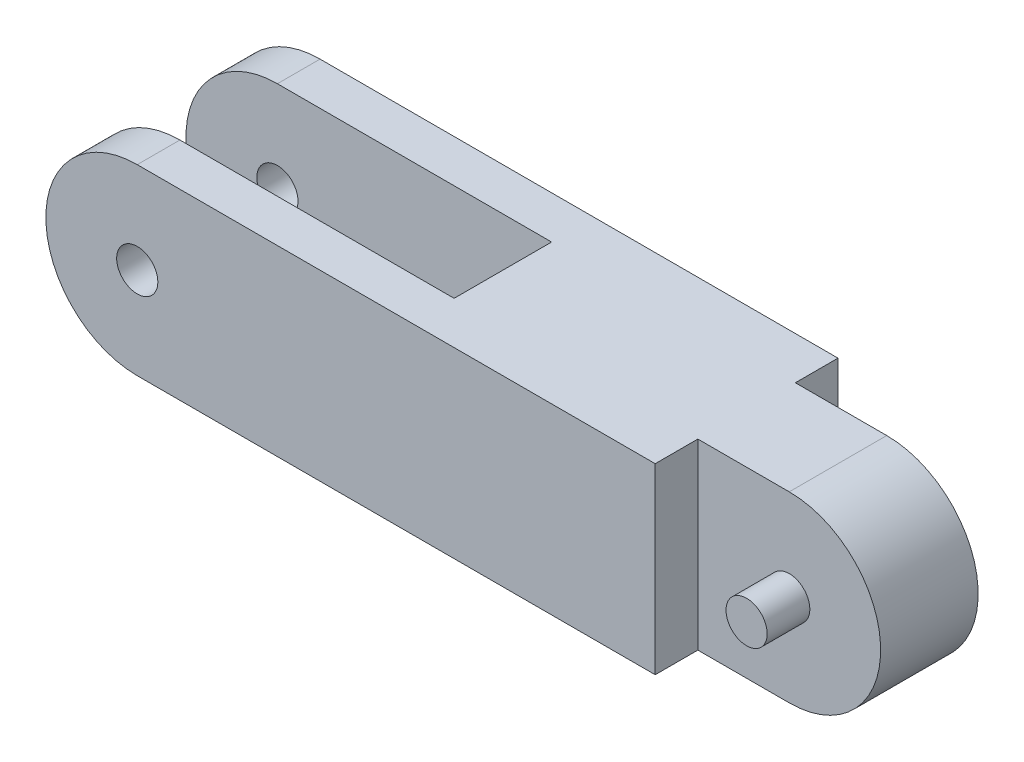
ISO-10303-21;
HEADER;
FILE_DESCRIPTION(('STEP AP214'),'2;1');
FILE_NAME('part.step','',(''),(''),'','','');
FILE_SCHEMA(('AUTOMOTIVE_DESIGN { 1 0 10303 214 1 1 1 1 }'));
ENDSEC;
DATA;
#1=APPLICATION_CONTEXT('core data for automotive mechanical design processes');
#2=APPLICATION_PROTOCOL_DEFINITION('international standard','automotive_design',2000,#1);
#3=PRODUCT_CONTEXT('',#1,'mechanical');
#4=PRODUCT('Part','Part','',(#3));
#5=PRODUCT_RELATED_PRODUCT_CATEGORY('part','',(#4));
#6=PRODUCT_DEFINITION_FORMATION('','',#4);
#7=PRODUCT_DEFINITION_CONTEXT('part definition',#1,'design');
#8=PRODUCT_DEFINITION('design','',#6,#7);
#9=PRODUCT_DEFINITION_SHAPE('','',#8);
#10=(LENGTH_UNIT() NAMED_UNIT(*) SI_UNIT(.MILLI.,.METRE.));
#11=(NAMED_UNIT(*) PLANE_ANGLE_UNIT() SI_UNIT($,.RADIAN.));
#12=(NAMED_UNIT(*) SI_UNIT($,.STERADIAN.) SOLID_ANGLE_UNIT());
#13=UNCERTAINTY_MEASURE_WITH_UNIT(LENGTH_MEASURE(1.E-05),#10,'distance_accuracy_value','');
#14=(GEOMETRIC_REPRESENTATION_CONTEXT(3) GLOBAL_UNCERTAINTY_ASSIGNED_CONTEXT((#13)) GLOBAL_UNIT_ASSIGNED_CONTEXT((#10,
#11,#12)) REPRESENTATION_CONTEXT('',''));
#15=CARTESIAN_POINT('',(0.,0.,0.));
#16=DIRECTION('',(0.,0.,1.));
#17=DIRECTION('',(1.,0.,0.));
#18=AXIS2_PLACEMENT_3D('',#15,#16,#17);
#19=CARTESIAN_POINT('',(-50.,0.,15.));
#20=DIRECTION('',(0.,0.,-1.));
#21=DIRECTION('',(-1.,0.,0.));
#22=AXIS2_PLACEMENT_3D('',#19,#20,#21);
#23=CYLINDRICAL_SURFACE('',#22,15.);
#24=CARTESIAN_POINT('',(-50.,0.,-8.));
#25=DIRECTION('',(0.,0.,-1.));
#26=DIRECTION('',(-1.,0.,0.));
#27=AXIS2_PLACEMENT_3D('',#24,#25,#26);
#28=CIRCLE('',#27,15.);
#29=CARTESIAN_POINT('',(-50.,-15.,-8.));
#30=VERTEX_POINT('',#29);
#31=CARTESIAN_POINT('',(-50.,15.,-8.));
#32=VERTEX_POINT('',#31);
#33=EDGE_CURVE('E183',#30,#32,#28,.T.);
#34=ORIENTED_EDGE('',*,*,#33,.T.);
#35=DIRECTION('',(0.,0.,-1.));
#36=VECTOR('',#35,1.);
#37=CARTESIAN_POINT('',(-50.,15.,15.));
#38=LINE('',#37,#36);
#39=CARTESIAN_POINT('',(-50.,15.,-15.));
#40=VERTEX_POINT('',#39);
#41=EDGE_CURVE('E209',#32,#40,#38,.T.);
#42=ORIENTED_EDGE('',*,*,#41,.T.);
#43=CARTESIAN_POINT('',(-50.,0.,-15.));
#44=DIRECTION('',(0.,0.,1.));
#45=DIRECTION('',(1.,0.,0.));
#46=AXIS2_PLACEMENT_3D('',#43,#44,#45);
#47=CIRCLE('',#46,15.);
#48=CARTESIAN_POINT('',(-50.,-15.,-15.));
#49=VERTEX_POINT('',#48);
#50=EDGE_CURVE('E199',#40,#49,#47,.T.);
#51=ORIENTED_EDGE('',*,*,#50,.T.);
#52=DIRECTION('',(0.,0.,-1.));
#53=VECTOR('',#52,1.);
#54=CARTESIAN_POINT('',(-50.,-15.,15.));
#55=LINE('',#54,#53);
#56=EDGE_CURVE('E226',#30,#49,#55,.T.);
#57=ORIENTED_EDGE('',*,*,#56,.F.);
#58=EDGE_LOOP('',(#34,#42,#51,#57));
#59=FACE_BOUND('',#58,.T.);
#60=ADVANCED_FACE('F33',(#59),#23,.T.);
#61=CARTESIAN_POINT('',(-50.,0.,15.));
#62=DIRECTION('',(0.,0.,1.));
#63=DIRECTION('',(1.,0.,0.));
#64=AXIS2_PLACEMENT_3D('',#61,#62,#63);
#65=CYLINDRICAL_SURFACE('',#64,3.37819999999998);
#66=CARTESIAN_POINT('',(-50.,0.,-8.));
#67=DIRECTION('',(0.,0.,-1.));
#68=DIRECTION('',(-1.,0.,0.));
#69=AXIS2_PLACEMENT_3D('',#66,#67,#68);
#70=CIRCLE('',#69,3.37819999999998);
#71=CARTESIAN_POINT('',(-53.3782,0.,-8.));
#72=VERTEX_POINT('',#71);
#73=EDGE_CURVE('E182',#72,#72,#70,.F.);
#74=ORIENTED_EDGE('',*,*,#73,.T.);
#75=EDGE_LOOP('',(#74));
#76=FACE_BOUND('',#75,.T.);
#77=CARTESIAN_POINT('',(-50.,0.,-15.));
#78=DIRECTION('',(0.,0.,1.));
#79=DIRECTION('',(1.,0.,0.));
#80=AXIS2_PLACEMENT_3D('',#77,#78,#79);
#81=CIRCLE('',#80,3.37819999999998);
#82=CARTESIAN_POINT('',(-46.6218,0.,-15.));
#83=VERTEX_POINT('',#82);
#84=EDGE_CURVE('E196',#83,#83,#81,.T.);
#85=ORIENTED_EDGE('',*,*,#84,.F.);
#86=EDGE_LOOP('',(#85));
#87=FACE_BOUND('',#86,.T.);
#88=ADVANCED_FACE('F280',(#76,#87),#65,.F.);
#89=CARTESIAN_POINT('',(-50.,15.,15.));
#90=VERTEX_POINT('',#89);
#91=CARTESIAN_POINT('',(-50.,15.,8.));
#92=VERTEX_POINT('',#91);
#93=EDGE_CURVE('E217',#90,#92,#38,.T.);
#94=ORIENTED_EDGE('',*,*,#93,.T.);
#95=CARTESIAN_POINT('',(-50.,0.,8.));
#96=DIRECTION('',(0.,0.,1.));
#97=DIRECTION('',(1.,0.,0.));
#98=AXIS2_PLACEMENT_3D('',#95,#96,#97);
#99=CIRCLE('',#98,15.);
#100=CARTESIAN_POINT('',(-50.,-15.,8.));
#101=VERTEX_POINT('',#100);
#102=EDGE_CURVE('E48',#92,#101,#99,.T.);
#103=ORIENTED_EDGE('',*,*,#102,.T.);
#104=CARTESIAN_POINT('',(-50.,-15.,15.));
#105=VERTEX_POINT('',#104);
#106=EDGE_CURVE('E142',#105,#101,#55,.T.);
#107=ORIENTED_EDGE('',*,*,#106,.F.);
#108=CARTESIAN_POINT('',(-50.,0.,15.));
#109=DIRECTION('',(0.,0.,1.));
#110=DIRECTION('',(1.,0.,0.));
#111=AXIS2_PLACEMENT_3D('',#108,#109,#110);
#112=CIRCLE('',#111,15.);
#113=EDGE_CURVE('E200',#90,#105,#112,.T.);
#114=ORIENTED_EDGE('',*,*,#113,.F.);
#115=EDGE_LOOP('',(#94,#103,#107,#114));
#116=FACE_BOUND('',#115,.T.);
#117=ADVANCED_FACE('F35',(#116),#23,.T.);
#118=CARTESIAN_POINT('',(-50.,-15.,15.));
#119=DIRECTION('',(0.,1.,0.));
#120=DIRECTION('',(-1.,0.,0.));
#121=AXIS2_PLACEMENT_3D('',#118,#119,#120);
#122=PLANE('',#121);
#123=DIRECTION('',(0.,0.,-1.));
#124=VECTOR('',#123,1.);
#125=CARTESIAN_POINT('',(-5.00000000000002,-15.,-8.));
#126=LINE('',#125,#124);
#127=CARTESIAN_POINT('',(-5.00000000000002,-15.,8.));
#128=VERTEX_POINT('',#127);
#129=CARTESIAN_POINT('',(-5.00000000000002,-15.,-8.));
#130=VERTEX_POINT('',#129);
#131=EDGE_CURVE('E134',#128,#130,#126,.T.);
#132=ORIENTED_EDGE('',*,*,#131,.T.);
#133=DIRECTION('',(-1.,0.,0.));
#134=VECTOR('',#133,1.);
#135=CARTESIAN_POINT('',(-65.,-15.,-8.));
#136=LINE('',#135,#134);
#137=EDGE_CURVE('E131',#130,#30,#136,.T.);
#138=ORIENTED_EDGE('',*,*,#137,.T.);
#139=ORIENTED_EDGE('',*,*,#56,.T.);
#140=DIRECTION('',(1.,0.,0.));
#141=VECTOR('',#140,1.);
#142=CARTESIAN_POINT('',(-50.,-15.,-15.));
#143=LINE('',#142,#141);
#144=CARTESIAN_POINT('',(35.,-15.,-15.));
#145=VERTEX_POINT('',#144);
#146=EDGE_CURVE('E212',#49,#145,#143,.T.);
#147=ORIENTED_EDGE('',*,*,#146,.T.);
#148=DIRECTION('',(0.,0.,1.));
#149=VECTOR('',#148,1.);
#150=CARTESIAN_POINT('',(35.,-15.,-28.9161112376698));
#151=LINE('',#150,#149);
#152=CARTESIAN_POINT('',(35.,-15.,-8.));
#153=VERTEX_POINT('',#152);
#154=EDGE_CURVE('E158',#145,#153,#151,.T.);
#155=ORIENTED_EDGE('',*,*,#154,.T.);
#156=DIRECTION('',(1.,0.,0.));
#157=VECTOR('',#156,1.);
#158=CARTESIAN_POINT('',(35.,-15.,-8.));
#159=LINE('',#158,#157);
#160=CARTESIAN_POINT('',(50.,-15.,-8.));
#161=VERTEX_POINT('',#160);
#162=EDGE_CURVE('E161',#153,#161,#159,.T.);
#163=ORIENTED_EDGE('',*,*,#162,.T.);
#164=DIRECTION('',(0.,0.,-1.));
#165=VECTOR('',#164,1.);
#166=CARTESIAN_POINT('',(50.,-15.,15.));
#167=LINE('',#166,#165);
#168=CARTESIAN_POINT('',(50.,-15.,8.));
#169=VERTEX_POINT('',#168);
#170=EDGE_CURVE('E223',#169,#161,#167,.T.);
#171=ORIENTED_EDGE('',*,*,#170,.F.);
#172=DIRECTION('',(-1.,0.,0.));
#173=VECTOR('',#172,1.);
#174=CARTESIAN_POINT('',(35.,-15.,8.));
#175=LINE('',#174,#173);
#176=CARTESIAN_POINT('',(35.,-15.,8.));
#177=VERTEX_POINT('',#176);
#178=EDGE_CURVE('E174',#169,#177,#175,.T.);
#179=ORIENTED_EDGE('',*,*,#178,.T.);
#180=DIRECTION('',(0.,0.,1.));
#181=VECTOR('',#180,1.);
#182=CARTESIAN_POINT('',(35.,-15.,28.9161112376696));
#183=LINE('',#182,#181);
#184=CARTESIAN_POINT('',(35.,-15.,15.));
#185=VERTEX_POINT('',#184);
#186=EDGE_CURVE('E171',#177,#185,#183,.T.);
#187=ORIENTED_EDGE('',*,*,#186,.T.);
#188=DIRECTION('',(1.,0.,0.));
#189=VECTOR('',#188,1.);
#190=CARTESIAN_POINT('',(-50.,-15.,15.));
#191=LINE('',#190,#189);
#192=EDGE_CURVE('E203',#105,#185,#191,.T.);
#193=ORIENTED_EDGE('',*,*,#192,.F.);
#194=ORIENTED_EDGE('',*,*,#106,.T.);
#195=DIRECTION('',(1.,0.,0.));
#196=VECTOR('',#195,1.);
#197=CARTESIAN_POINT('',(-65.,-15.,8.));
#198=LINE('',#197,#196);
#199=EDGE_CURVE('E124',#101,#128,#198,.T.);
#200=ORIENTED_EDGE('',*,*,#199,.T.);
#201=EDGE_LOOP('',(#132,#138,#139,#147,#155,#163,#171,#179,#187,#193,#194,#200));
#202=FACE_BOUND('',#201,.T.);
#203=ADVANCED_FACE('F140',(#202),#122,.F.);
#204=CARTESIAN_POINT('',(50.,0.,15.));
#205=DIRECTION('',(0.,0.,-1.));
#206=DIRECTION('',(-1.,0.,0.));
#207=AXIS2_PLACEMENT_3D('',#204,#205,#206);
#208=CYLINDRICAL_SURFACE('',#207,15.);
#209=ORIENTED_EDGE('',*,*,#170,.T.);
#210=CARTESIAN_POINT('',(50.,0.,-8.));
#211=DIRECTION('',(0.,0.,1.));
#212=DIRECTION('',(1.,0.,0.));
#213=AXIS2_PLACEMENT_3D('',#210,#211,#212);
#214=CIRCLE('',#213,15.);
#215=CARTESIAN_POINT('',(50.,15.,-8.));
#216=VERTEX_POINT('',#215);
#217=EDGE_CURVE('E190',#161,#216,#214,.T.);
#218=ORIENTED_EDGE('',*,*,#217,.T.);
#219=DIRECTION('',(0.,0.,-1.));
#220=VECTOR('',#219,1.);
#221=CARTESIAN_POINT('',(50.,15.,15.));
#222=LINE('',#221,#220);
#223=CARTESIAN_POINT('',(50.,15.,8.));
#224=VERTEX_POINT('',#223);
#225=EDGE_CURVE('E220',#224,#216,#222,.T.);
#226=ORIENTED_EDGE('',*,*,#225,.F.);
#227=CARTESIAN_POINT('',(50.,0.,8.));
#228=DIRECTION('',(0.,0.,-1.));
#229=DIRECTION('',(-1.,0.,0.));
#230=AXIS2_PLACEMENT_3D('',#227,#228,#229);
#231=CIRCLE('',#230,15.);
#232=EDGE_CURVE('E186',#224,#169,#231,.T.);
#233=ORIENTED_EDGE('',*,*,#232,.T.);
#234=EDGE_LOOP('',(#209,#218,#226,#233));
#235=FACE_BOUND('',#234,.T.);
#236=ADVANCED_FACE('F256',(#235),#208,.T.);
#237=CARTESIAN_POINT('',(-50.,15.,15.));
#238=DIRECTION('',(0.,-1.,0.));
#239=DIRECTION('',(1.,0.,0.));
#240=AXIS2_PLACEMENT_3D('',#237,#238,#239);
#241=PLANE('',#240);
#242=ORIENTED_EDGE('',*,*,#41,.F.);
#243=DIRECTION('',(-1.,0.,0.));
#244=VECTOR('',#243,1.);
#245=CARTESIAN_POINT('',(-65.,15.,-8.));
#246=LINE('',#245,#244);
#247=CARTESIAN_POINT('',(-5.00000000000002,15.,-8.));
#248=VERTEX_POINT('',#247);
#249=EDGE_CURVE('E143',#248,#32,#246,.T.);
#250=ORIENTED_EDGE('',*,*,#249,.F.);
#251=DIRECTION('',(0.,0.,-1.));
#252=VECTOR('',#251,1.);
#253=CARTESIAN_POINT('',(-5.00000000000002,15.,-8.));
#254=LINE('',#253,#252);
#255=CARTESIAN_POINT('',(-5.00000000000002,15.,8.));
#256=VERTEX_POINT('',#255);
#257=EDGE_CURVE('E146',#256,#248,#254,.T.);
#258=ORIENTED_EDGE('',*,*,#257,.F.);
#259=DIRECTION('',(1.,0.,0.));
#260=VECTOR('',#259,1.);
#261=CARTESIAN_POINT('',(-65.,15.,8.));
#262=LINE('',#261,#260);
#263=EDGE_CURVE('E126',#92,#256,#262,.T.);
#264=ORIENTED_EDGE('',*,*,#263,.F.);
#265=ORIENTED_EDGE('',*,*,#93,.F.);
#266=DIRECTION('',(-1.,0.,0.));
#267=VECTOR('',#266,1.);
#268=CARTESIAN_POINT('',(-50.,15.,15.));
#269=LINE('',#268,#267);
#270=CARTESIAN_POINT('',(35.,15.,15.));
#271=VERTEX_POINT('',#270);
#272=EDGE_CURVE('E207',#271,#90,#269,.T.);
#273=ORIENTED_EDGE('',*,*,#272,.F.);
#274=DIRECTION('',(0.,0.,1.));
#275=VECTOR('',#274,1.);
#276=CARTESIAN_POINT('',(35.,15.,28.9161112376696));
#277=LINE('',#276,#275);
#278=CARTESIAN_POINT('',(35.,15.,8.));
#279=VERTEX_POINT('',#278);
#280=EDGE_CURVE('E55',#279,#271,#277,.T.);
#281=ORIENTED_EDGE('',*,*,#280,.F.);
#282=DIRECTION('',(-1.,0.,0.));
#283=VECTOR('',#282,1.);
#284=CARTESIAN_POINT('',(35.,15.,8.));
#285=LINE('',#284,#283);
#286=EDGE_CURVE('E175',#224,#279,#285,.T.);
#287=ORIENTED_EDGE('',*,*,#286,.F.);
#288=ORIENTED_EDGE('',*,*,#225,.T.);
#289=DIRECTION('',(1.,0.,0.));
#290=VECTOR('',#289,1.);
#291=CARTESIAN_POINT('',(35.,15.,-8.));
#292=LINE('',#291,#290);
#293=CARTESIAN_POINT('',(35.,15.,-8.));
#294=VERTEX_POINT('',#293);
#295=EDGE_CURVE('E162',#294,#216,#292,.T.);
#296=ORIENTED_EDGE('',*,*,#295,.F.);
#297=DIRECTION('',(0.,0.,1.));
#298=VECTOR('',#297,1.);
#299=CARTESIAN_POINT('',(35.,15.,-28.9161112376698));
#300=LINE('',#299,#298);
#301=CARTESIAN_POINT('',(35.,15.,-15.));
#302=VERTEX_POINT('',#301);
#303=EDGE_CURVE('E165',#302,#294,#300,.T.);
#304=ORIENTED_EDGE('',*,*,#303,.F.);
#305=DIRECTION('',(-1.,0.,0.));
#306=VECTOR('',#305,1.);
#307=CARTESIAN_POINT('',(-50.,15.,-15.));
#308=LINE('',#307,#306);
#309=EDGE_CURVE('E204',#302,#40,#308,.T.);
#310=ORIENTED_EDGE('',*,*,#309,.T.);
#311=EDGE_LOOP('',(#242,#250,#258,#264,#265,#273,#281,#287,#288,#296,#304,#310));
#312=FACE_BOUND('',#311,.T.);
#313=ADVANCED_FACE('F248',(#312),#241,.F.);
#314=CARTESIAN_POINT('',(-50.,0.,15.));
#315=DIRECTION('',(0.,0.,1.));
#316=DIRECTION('',(1.,0.,0.));
#317=AXIS2_PLACEMENT_3D('',#314,#315,#316);
#318=PLANE('',#317);
#319=DIRECTION('',(0.,-1.,0.));
#320=VECTOR('',#319,1.);
#321=CARTESIAN_POINT('',(35.,0.,15.));
#322=LINE('',#321,#320);
#323=EDGE_CURVE('E11',#271,#185,#322,.T.);
#324=ORIENTED_EDGE('',*,*,#323,.F.);
#325=ORIENTED_EDGE('',*,*,#272,.T.);
#326=ORIENTED_EDGE('',*,*,#113,.T.);
#327=ORIENTED_EDGE('',*,*,#192,.T.);
#328=EDGE_LOOP('',(#324,#325,#326,#327));
#329=FACE_BOUND('',#328,.T.);
#330=CARTESIAN_POINT('',(-50.,0.,15.));
#331=DIRECTION('',(0.,0.,1.));
#332=DIRECTION('',(1.,0.,0.));
#333=AXIS2_PLACEMENT_3D('',#330,#331,#332);
#334=CIRCLE('',#333,3.37819999999998);
#335=CARTESIAN_POINT('',(-46.6218,0.,15.));
#336=VERTEX_POINT('',#335);
#337=EDGE_CURVE('E193',#336,#336,#334,.T.);
#338=ORIENTED_EDGE('',*,*,#337,.F.);
#339=EDGE_LOOP('',(#338));
#340=FACE_BOUND('',#339,.T.);
#341=ADVANCED_FACE('F265',(#329,#340),#318,.T.);
#342=CARTESIAN_POINT('',(-50.,0.,-15.));
#343=DIRECTION('',(0.,0.,1.));
#344=DIRECTION('',(1.,0.,0.));
#345=AXIS2_PLACEMENT_3D('',#342,#343,#344);
#346=PLANE('',#345);
#347=ORIENTED_EDGE('',*,*,#84,.T.);
#348=EDGE_LOOP('',(#347));
#349=FACE_BOUND('',#348,.T.);
#350=ORIENTED_EDGE('',*,*,#309,.F.);
#351=DIRECTION('',(0.,-1.,0.));
#352=VECTOR('',#351,1.);
#353=CARTESIAN_POINT('',(35.,0.,-15.));
#354=LINE('',#353,#352);
#355=EDGE_CURVE('E41',#302,#145,#354,.T.);
#356=ORIENTED_EDGE('',*,*,#355,.T.);
#357=ORIENTED_EDGE('',*,*,#146,.F.);
#358=ORIENTED_EDGE('',*,*,#50,.F.);
#359=EDGE_LOOP('',(#350,#356,#357,#358));
#360=FACE_BOUND('',#359,.T.);
#361=ADVANCED_FACE('F239',(#349,#360),#346,.F.);
#362=CARTESIAN_POINT('',(-50.,0.,8.));
#363=DIRECTION('',(0.,0.,1.));
#364=DIRECTION('',(1.,0.,0.));
#365=AXIS2_PLACEMENT_3D('',#362,#363,#364);
#366=CIRCLE('',#365,3.37819999999998);
#367=CARTESIAN_POINT('',(-46.6218,0.,8.));
#368=VERTEX_POINT('',#367);
#369=EDGE_CURVE('E156',#368,#368,#366,.F.);
#370=ORIENTED_EDGE('',*,*,#369,.T.);
#371=EDGE_LOOP('',(#370));
#372=FACE_BOUND('',#371,.T.);
#373=ORIENTED_EDGE('',*,*,#337,.T.);
#374=EDGE_LOOP('',(#373));
#375=FACE_BOUND('',#374,.T.);
#376=ADVANCED_FACE('F285',(#372,#375),#65,.F.);
#377=CARTESIAN_POINT('',(-65.,-15.,-8.));
#378=DIRECTION('',(0.,0.,-1.));
#379=DIRECTION('',(-1.,0.,0.));
#380=AXIS2_PLACEMENT_3D('',#377,#378,#379);
#381=PLANE('',#380);
#382=ORIENTED_EDGE('',*,*,#73,.F.);
#383=EDGE_LOOP('',(#382));
#384=FACE_BOUND('',#383,.T.);
#385=ORIENTED_EDGE('',*,*,#33,.F.);
#386=ORIENTED_EDGE('',*,*,#137,.F.);
#387=DIRECTION('',(0.,1.,0.));
#388=VECTOR('',#387,1.);
#389=CARTESIAN_POINT('',(-5.00000000000002,-15.,-8.));
#390=LINE('',#389,#388);
#391=EDGE_CURVE('E130',#130,#248,#390,.T.);
#392=ORIENTED_EDGE('',*,*,#391,.T.);
#393=ORIENTED_EDGE('',*,*,#249,.T.);
#394=EDGE_LOOP('',(#385,#386,#392,#393));
#395=FACE_BOUND('',#394,.T.);
#396=ADVANCED_FACE('F303',(#384,#395),#381,.F.);
#397=CARTESIAN_POINT('',(-65.,-15.,8.));
#398=DIRECTION('',(0.,0.,1.));
#399=DIRECTION('',(1.,0.,0.));
#400=AXIS2_PLACEMENT_3D('',#397,#398,#399);
#401=PLANE('',#400);
#402=ORIENTED_EDGE('',*,*,#369,.F.);
#403=EDGE_LOOP('',(#402));
#404=FACE_BOUND('',#403,.T.);
#405=ORIENTED_EDGE('',*,*,#263,.T.);
#406=DIRECTION('',(0.,1.,0.));
#407=VECTOR('',#406,1.);
#408=CARTESIAN_POINT('',(-5.00000000000002,-15.,8.));
#409=LINE('',#408,#407);
#410=EDGE_CURVE('E120',#128,#256,#409,.T.);
#411=ORIENTED_EDGE('',*,*,#410,.F.);
#412=ORIENTED_EDGE('',*,*,#199,.F.);
#413=ORIENTED_EDGE('',*,*,#102,.F.);
#414=EDGE_LOOP('',(#405,#411,#412,#413));
#415=FACE_BOUND('',#414,.T.);
#416=ADVANCED_FACE('F122',(#404,#415),#401,.F.);
#417=CARTESIAN_POINT('',(-5.00000000000002,-15.,-8.));
#418=DIRECTION('',(1.,0.,0.));
#419=DIRECTION('',(0.,1.,0.));
#420=AXIS2_PLACEMENT_3D('',#417,#418,#419);
#421=PLANE('',#420);
#422=ORIENTED_EDGE('',*,*,#257,.T.);
#423=ORIENTED_EDGE('',*,*,#391,.F.);
#424=ORIENTED_EDGE('',*,*,#131,.F.);
#425=ORIENTED_EDGE('',*,*,#410,.T.);
#426=EDGE_LOOP('',(#422,#423,#424,#425));
#427=FACE_BOUND('',#426,.T.);
#428=ADVANCED_FACE('F135',(#427),#421,.F.);
#429=CARTESIAN_POINT('',(35.,-15.,8.));
#430=DIRECTION('',(0.,0.,-1.));
#431=DIRECTION('',(-1.,0.,0.));
#432=AXIS2_PLACEMENT_3D('',#429,#430,#431);
#433=PLANE('',#432);
#434=CARTESIAN_POINT('',(50.,0.,8.));
#435=DIRECTION('',(0.,0.,-1.));
#436=DIRECTION('',(-1.,0.,0.));
#437=AXIS2_PLACEMENT_3D('',#434,#435,#436);
#438=CIRCLE('',#437,3.37819999999998);
#439=CARTESIAN_POINT('',(46.6218,0.,8.));
#440=VERTEX_POINT('',#439);
#441=EDGE_CURVE('E185',#440,#440,#438,.F.);
#442=ORIENTED_EDGE('',*,*,#441,.F.);
#443=EDGE_LOOP('',(#442));
#444=FACE_BOUND('',#443,.T.);
#445=ORIENTED_EDGE('',*,*,#286,.T.);
#446=DIRECTION('',(0.,1.,0.));
#447=VECTOR('',#446,1.);
#448=CARTESIAN_POINT('',(35.,-15.,8.));
#449=LINE('',#448,#447);
#450=EDGE_CURVE('E167',#177,#279,#449,.T.);
#451=ORIENTED_EDGE('',*,*,#450,.F.);
#452=ORIENTED_EDGE('',*,*,#178,.F.);
#453=ORIENTED_EDGE('',*,*,#232,.F.);
#454=EDGE_LOOP('',(#445,#451,#452,#453));
#455=FACE_BOUND('',#454,.T.);
#456=ADVANCED_FACE('F260',(#444,#455),#433,.F.);
#457=CARTESIAN_POINT('',(35.,-15.,28.9161112376696));
#458=DIRECTION('',(-1.,0.,0.));
#459=DIRECTION('',(0.,0.,1.));
#460=AXIS2_PLACEMENT_3D('',#457,#458,#459);
#461=PLANE('',#460);
#462=ORIENTED_EDGE('',*,*,#323,.T.);
#463=ORIENTED_EDGE('',*,*,#186,.F.);
#464=ORIENTED_EDGE('',*,*,#450,.T.);
#465=ORIENTED_EDGE('',*,*,#280,.T.);
#466=EDGE_LOOP('',(#462,#463,#464,#465));
#467=FACE_BOUND('',#466,.T.);
#468=ADVANCED_FACE('F268',(#467),#461,.F.);
#469=CARTESIAN_POINT('',(35.,-15.,-28.9161112376698));
#470=DIRECTION('',(-1.,0.,0.));
#471=DIRECTION('',(0.,0.,1.));
#472=AXIS2_PLACEMENT_3D('',#469,#470,#471);
#473=PLANE('',#472);
#474=ORIENTED_EDGE('',*,*,#303,.T.);
#475=DIRECTION('',(0.,1.,0.));
#476=VECTOR('',#475,1.);
#477=CARTESIAN_POINT('',(35.,-15.,-8.));
#478=LINE('',#477,#476);
#479=EDGE_CURVE('E154',#153,#294,#478,.T.);
#480=ORIENTED_EDGE('',*,*,#479,.F.);
#481=ORIENTED_EDGE('',*,*,#154,.F.);
#482=ORIENTED_EDGE('',*,*,#355,.F.);
#483=EDGE_LOOP('',(#474,#480,#481,#482));
#484=FACE_BOUND('',#483,.T.);
#485=ADVANCED_FACE('F250',(#484),#473,.F.);
#486=CARTESIAN_POINT('',(35.,-15.,-8.));
#487=DIRECTION('',(0.,0.,1.));
#488=DIRECTION('',(1.,0.,0.));
#489=AXIS2_PLACEMENT_3D('',#486,#487,#488);
#490=PLANE('',#489);
#491=CARTESIAN_POINT('',(50.,0.,-8.));
#492=DIRECTION('',(0.,0.,1.));
#493=DIRECTION('',(1.,0.,0.));
#494=AXIS2_PLACEMENT_3D('',#491,#492,#493);
#495=CIRCLE('',#494,3.37819999999998);
#496=CARTESIAN_POINT('',(53.3782,0.,-8.));
#497=VERTEX_POINT('',#496);
#498=EDGE_CURVE('E189',#497,#497,#495,.F.);
#499=ORIENTED_EDGE('',*,*,#498,.F.);
#500=EDGE_LOOP('',(#499));
#501=FACE_BOUND('',#500,.T.);
#502=ORIENTED_EDGE('',*,*,#162,.F.);
#503=ORIENTED_EDGE('',*,*,#479,.T.);
#504=ORIENTED_EDGE('',*,*,#295,.T.);
#505=ORIENTED_EDGE('',*,*,#217,.F.);
#506=EDGE_LOOP('',(#502,#503,#504,#505));
#507=FACE_BOUND('',#506,.T.);
#508=ADVANCED_FACE('F253',(#501,#507),#490,.F.);
#509=CARTESIAN_POINT('',(-50.,0.,-15.));
#510=DIRECTION('',(0.,0.,1.));
#511=DIRECTION('',(1.,0.,0.));
#512=AXIS2_PLACEMENT_3D('',#509,#510,#511);
#513=PLANE('',#512);
#514=CARTESIAN_POINT('',(50.,0.,-15.));
#515=DIRECTION('',(0.,0.,1.));
#516=DIRECTION('',(1.,0.,0.));
#517=AXIS2_PLACEMENT_3D('',#514,#515,#516);
#518=CIRCLE('',#517,3.37819999999999);
#519=CARTESIAN_POINT('',(53.3782,0.,-15.));
#520=VERTEX_POINT('',#519);
#521=EDGE_CURVE('E349',#520,#520,#518,.F.);
#522=ORIENTED_EDGE('',*,*,#521,.T.);
#523=EDGE_LOOP('',(#522));
#524=FACE_BOUND('',#523,.T.);
#525=ADVANCED_FACE('F322',(#524),#513,.F.);
#526=CARTESIAN_POINT('',(50.,0.,24.5549925128175));
#527=DIRECTION('',(0.,0.,-1.));
#528=DIRECTION('',(-1.,0.,0.));
#529=AXIS2_PLACEMENT_3D('',#526,#527,#528);
#530=CYLINDRICAL_SURFACE('',#529,3.37819999999999);
#531=ORIENTED_EDGE('',*,*,#521,.F.);
#532=EDGE_LOOP('',(#531));
#533=FACE_BOUND('',#532,.T.);
#534=ORIENTED_EDGE('',*,*,#498,.T.);
#535=EDGE_LOOP('',(#534));
#536=FACE_BOUND('',#535,.T.);
#537=ADVANCED_FACE('F327',(#533,#536),#530,.T.);
#538=CARTESIAN_POINT('',(50.,0.,15.));
#539=DIRECTION('',(0.,0.,1.));
#540=DIRECTION('',(1.,0.,0.));
#541=AXIS2_PLACEMENT_3D('',#538,#539,#540);
#542=CIRCLE('',#541,3.37819999999999);
#543=CARTESIAN_POINT('',(53.3782,0.,15.));
#544=VERTEX_POINT('',#543);
#545=EDGE_CURVE('E149',#544,#544,#542,.T.);
#546=ORIENTED_EDGE('',*,*,#545,.F.);
#547=EDGE_LOOP('',(#546));
#548=FACE_BOUND('',#547,.T.);
#549=ORIENTED_EDGE('',*,*,#441,.T.);
#550=EDGE_LOOP('',(#549));
#551=FACE_BOUND('',#550,.T.);
#552=ADVANCED_FACE('F333',(#548,#551),#530,.T.);
#553=CARTESIAN_POINT('',(-50.,0.,15.));
#554=DIRECTION('',(0.,0.,1.));
#555=DIRECTION('',(1.,0.,0.));
#556=AXIS2_PLACEMENT_3D('',#553,#554,#555);
#557=PLANE('',#556);
#558=ORIENTED_EDGE('',*,*,#545,.T.);
#559=EDGE_LOOP('',(#558));
#560=FACE_BOUND('',#559,.T.);
#561=ADVANCED_FACE('F339',(#560),#557,.T.);
#562=CLOSED_SHELL('',(#60,#88,#117,#203,#236,#313,#341,#361,#376,#396,#416,#428,#456,#468,#485,
#508,#525,#537,#552,#561));
#563=MANIFOLD_SOLID_BREP('B2',#562);
#564=ADVANCED_BREP_SHAPE_REPRESENTATION('',(#18,#563),#14);
#565=SHAPE_DEFINITION_REPRESENTATION(#9,#564);
ENDSEC;
END-ISO-10303-21;
